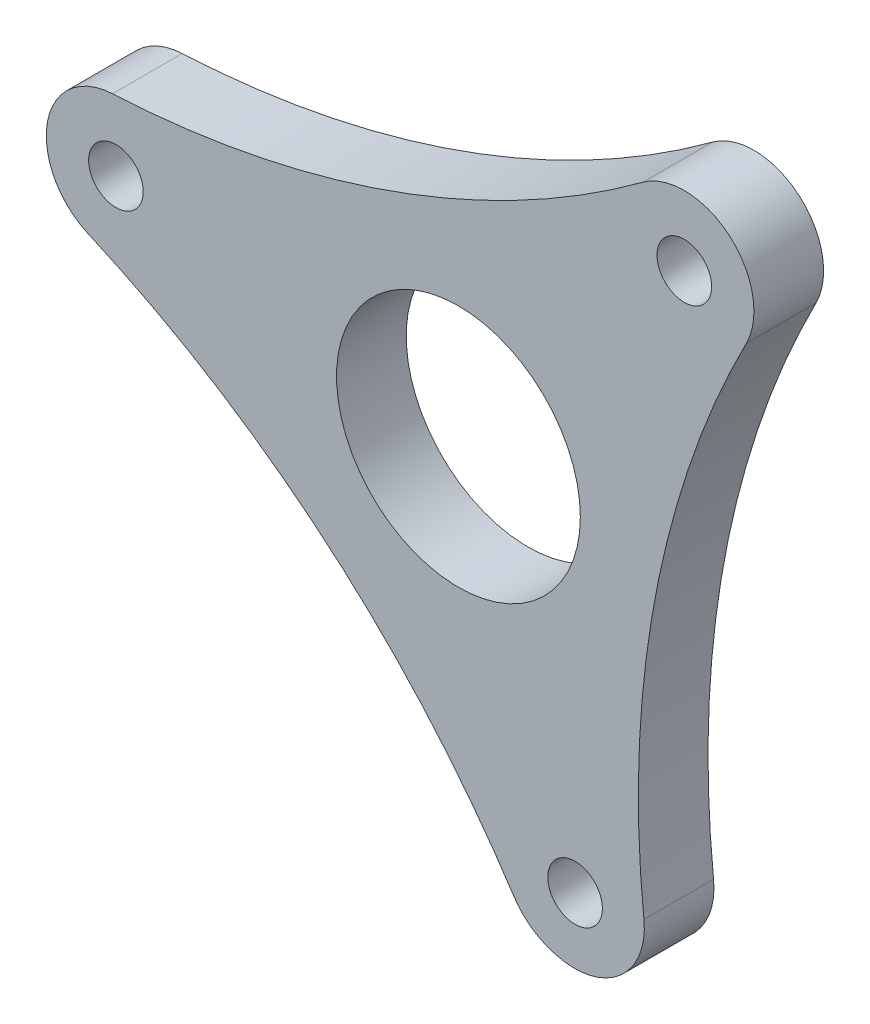
ISO-10303-21;
HEADER;
FILE_DESCRIPTION(('STEP AP214'),'2;1');
FILE_NAME('part.step','',(''),(''),'','','');
FILE_SCHEMA(('AUTOMOTIVE_DESIGN { 1 0 10303 214 1 1 1 1 }'));
ENDSEC;
DATA;
#1=APPLICATION_CONTEXT('core data for automotive mechanical design processes');
#2=APPLICATION_PROTOCOL_DEFINITION('international standard','automotive_design',2000,#1);
#3=PRODUCT_CONTEXT('',#1,'mechanical');
#4=PRODUCT('Part','Part','',(#3));
#5=PRODUCT_RELATED_PRODUCT_CATEGORY('part','',(#4));
#6=PRODUCT_DEFINITION_FORMATION('','',#4);
#7=PRODUCT_DEFINITION_CONTEXT('part definition',#1,'design');
#8=PRODUCT_DEFINITION('design','',#6,#7);
#9=PRODUCT_DEFINITION_SHAPE('','',#8);
#10=(LENGTH_UNIT() NAMED_UNIT(*) SI_UNIT(.MILLI.,.METRE.));
#11=(NAMED_UNIT(*) PLANE_ANGLE_UNIT() SI_UNIT($,.RADIAN.));
#12=(NAMED_UNIT(*) SI_UNIT($,.STERADIAN.) SOLID_ANGLE_UNIT());
#13=UNCERTAINTY_MEASURE_WITH_UNIT(LENGTH_MEASURE(1.E-05),#10,'distance_accuracy_value','');
#14=(GEOMETRIC_REPRESENTATION_CONTEXT(3) GLOBAL_UNCERTAINTY_ASSIGNED_CONTEXT((#13)) GLOBAL_UNIT_ASSIGNED_CONTEXT((#10,
#11,#12)) REPRESENTATION_CONTEXT('',''));
#15=CARTESIAN_POINT('',(0.,0.,0.));
#16=DIRECTION('',(0.,0.,1.));
#17=DIRECTION('',(1.,0.,0.));
#18=AXIS2_PLACEMENT_3D('',#15,#16,#17);
#19=CARTESIAN_POINT('',(86.3153760272279,-150.073761741357,6.35));
#20=DIRECTION('',(0.,0.,-1.));
#21=DIRECTION('',(-1.,0.,0.));
#22=AXIS2_PLACEMENT_3D('',#19,#20,#21);
#23=CYLINDRICAL_SURFACE('',#22,88.9);
#24=CARTESIAN_POINT('',(86.3153760272279,-150.073761741357,0.));
#25=DIRECTION('',(0.,0.,1.));
#26=DIRECTION('',(1.,0.,0.));
#27=AXIS2_PLACEMENT_3D('',#24,#25,#26);
#28=CIRCLE('',#27,88.9);
#29=CARTESIAN_POINT('',(121.980156320877,-68.6413760056704,0.));
#30=VERTEX_POINT('',#29);
#31=CARTESIAN_POINT('',(160.795035081524,-101.535216365998,0.));
#32=VERTEX_POINT('',#31);
#33=EDGE_CURVE('E144',#30,#32,#28,.F.);
#34=ORIENTED_EDGE('',*,*,#33,.T.);
#35=DIRECTION('',(0.,0.,-1.));
#36=VECTOR('',#35,1.);
#37=CARTESIAN_POINT('',(160.795035081527,-101.535216366003,6.35));
#38=LINE('',#37,#36);
#39=CARTESIAN_POINT('',(160.795035081524,-101.535216365998,6.35));
#40=VERTEX_POINT('',#39);
#41=EDGE_CURVE('E58',#32,#40,#38,.F.);
#42=ORIENTED_EDGE('',*,*,#41,.T.);
#43=CARTESIAN_POINT('',(86.3153760272279,-150.073761741357,6.35));
#44=DIRECTION('',(0.,0.,1.));
#45=DIRECTION('',(1.,0.,0.));
#46=AXIS2_PLACEMENT_3D('',#43,#44,#45);
#47=CIRCLE('',#46,88.9);
#48=CARTESIAN_POINT('',(121.980156320877,-68.6413760056704,6.35));
#49=VERTEX_POINT('',#48);
#50=EDGE_CURVE('E180',#49,#40,#47,.F.);
#51=ORIENTED_EDGE('',*,*,#50,.F.);
#52=DIRECTION('',(0.,0.,-1.));
#53=VECTOR('',#52,1.);
#54=CARTESIAN_POINT('',(121.980156320877,-68.6413760056704,6.35));
#55=LINE('',#54,#53);
#56=EDGE_CURVE('E137',#49,#30,#55,.T.);
#57=ORIENTED_EDGE('',*,*,#56,.T.);
#58=EDGE_LOOP('',(#34,#42,#51,#57));
#59=FACE_BOUND('',#58,.T.);
#60=ADVANCED_FACE('F35',(#59),#23,.F.);
#61=CARTESIAN_POINT('',(-15.0821674434747,-54.6417006359264,6.35));
#62=DIRECTION('',(0.266069897531643,0.963953738323319,0.));
#63=DIRECTION('',(-0.963953738323319,0.266069897531643,0.));
#64=AXIS2_PLACEMENT_3D('',#61,#62,#63);
#65=PLANE('',#64);
#66=DIRECTION('',(0.963953738323319,-0.266069897531643,0.));
#67=VECTOR('',#66,1.);
#68=CARTESIAN_POINT('',(-15.0821674434747,-54.6417006359264,6.35));
#69=LINE('',#68,#67);
#70=CARTESIAN_POINT('',(164.425466878937,-104.189283648973,6.35));
#71=VERTEX_POINT('',#70);
#72=CARTESIAN_POINT('',(164.659124528014,-104.253777684606,6.35));
#73=VERTEX_POINT('',#72);
#74=EDGE_CURVE('E109',#71,#73,#69,.T.);
#75=ORIENTED_EDGE('',*,*,#74,.F.);
#76=DIRECTION('',(0.,0.,-1.));
#77=VECTOR('',#76,1.);
#78=CARTESIAN_POINT('',(164.425466878937,-104.189283648973,6.35));
#79=LINE('',#78,#77);
#80=CARTESIAN_POINT('',(164.425466878937,-104.189283648973,0.));
#81=VERTEX_POINT('',#80);
#82=EDGE_CURVE('E170',#71,#81,#79,.T.);
#83=ORIENTED_EDGE('',*,*,#82,.T.);
#84=DIRECTION('',(0.963953738323319,-0.266069897531643,0.));
#85=VECTOR('',#84,1.);
#86=CARTESIAN_POINT('',(-15.0821674434747,-54.6417006359264,0.));
#87=LINE('',#86,#85);
#88=CARTESIAN_POINT('',(164.659124528014,-104.253777684606,0.));
#89=VERTEX_POINT('',#88);
#90=EDGE_CURVE('E146',#81,#89,#87,.T.);
#91=ORIENTED_EDGE('',*,*,#90,.T.);
#92=DIRECTION('',(0.,0.,-1.));
#93=VECTOR('',#92,1.);
#94=CARTESIAN_POINT('',(164.659124528014,-104.253777684606,6.35));
#95=LINE('',#94,#93);
#96=EDGE_CURVE('E118',#89,#73,#95,.F.);
#97=ORIENTED_EDGE('',*,*,#96,.T.);
#98=EDGE_LOOP('',(#75,#83,#91,#97));
#99=FACE_BOUND('',#98,.T.);
#100=ADVANCED_FACE('F184',(#99),#65,.F.);
#101=CARTESIAN_POINT('',(261.053590321017,-87.9571980104894,6.35));
#102=DIRECTION('',(0.,0.,-1.));
#103=DIRECTION('',(-1.,0.,0.));
#104=AXIS2_PLACEMENT_3D('',#101,#102,#103);
#105=CYLINDRICAL_SURFACE('',#104,88.9);
#106=CARTESIAN_POINT('',(261.053590321017,-87.9571980104894,6.35));
#107=DIRECTION('',(0.,0.,1.));
#108=DIRECTION('',(1.,0.,0.));
#109=AXIS2_PLACEMENT_3D('',#106,#107,#108);
#110=CIRCLE('',#109,88.9);
#111=CARTESIAN_POINT('',(172.662329840252,-97.4543065505352,6.35));
#112=VERTEX_POINT('',#111);
#113=CARTESIAN_POINT('',(181.990994200693,-47.3085092897694,6.35));
#114=VERTEX_POINT('',#113);
#115=EDGE_CURVE('E100',#112,#114,#110,.F.);
#116=ORIENTED_EDGE('',*,*,#115,.F.);
#117=DIRECTION('',(0.,0.,-1.));
#118=VECTOR('',#117,1.);
#119=CARTESIAN_POINT('',(172.662329840252,-97.4543065505353,6.35));
#120=LINE('',#119,#118);
#121=CARTESIAN_POINT('',(172.662329840252,-97.4543065505352,0.));
#122=VERTEX_POINT('',#121);
#123=EDGE_CURVE('E11',#112,#122,#120,.T.);
#124=ORIENTED_EDGE('',*,*,#123,.T.);
#125=CARTESIAN_POINT('',(261.053590321017,-87.9571980104894,0.));
#126=DIRECTION('',(0.,0.,1.));
#127=DIRECTION('',(1.,0.,0.));
#128=AXIS2_PLACEMENT_3D('',#125,#126,#127);
#129=CIRCLE('',#128,88.9);
#130=CARTESIAN_POINT('',(181.990994200693,-47.3085092897694,0.));
#131=VERTEX_POINT('',#130);
#132=EDGE_CURVE('E115',#122,#131,#129,.F.);
#133=ORIENTED_EDGE('',*,*,#132,.T.);
#134=DIRECTION('',(0.,0.,-1.));
#135=VECTOR('',#134,1.);
#136=CARTESIAN_POINT('',(181.990994200693,-47.3085092897694,6.35));
#137=LINE('',#136,#135);
#138=EDGE_CURVE('E112',#114,#131,#137,.T.);
#139=ORIENTED_EDGE('',*,*,#138,.F.);
#140=EDGE_LOOP('',(#116,#124,#133,#139));
#141=FACE_BOUND('',#140,.T.);
#142=ADVANCED_FACE('F113',(#141),#105,.F.);
#143=CARTESIAN_POINT('',(176.343665906384,-44.4050315240038,6.35));
#144=DIRECTION('',(0.,0.,-1.));
#145=DIRECTION('',(-1.,0.,0.));
#146=AXIS2_PLACEMENT_3D('',#143,#144,#145);
#147=CYLINDRICAL_SURFACE('',#146,6.3499999999997);
#148=CARTESIAN_POINT('',(176.343665906384,-44.4050315240038,0.));
#149=DIRECTION('',(0.,0.,1.));
#150=DIRECTION('',(1.,0.,0.));
#151=AXIS2_PLACEMENT_3D('',#148,#149,#150);
#152=CIRCLE('',#151,6.3499999999997);
#153=CARTESIAN_POINT('',(172.580085578452,-39.2905459081088,0.));
#154=VERTEX_POINT('',#153);
#155=EDGE_CURVE('E150',#131,#154,#152,.T.);
#156=ORIENTED_EDGE('',*,*,#155,.T.);
#157=DIRECTION('',(0.,0.,-1.));
#158=VECTOR('',#157,1.);
#159=CARTESIAN_POINT('',(172.580085578452,-39.2905459081088,6.35));
#160=LINE('',#159,#158);
#161=CARTESIAN_POINT('',(172.580085578452,-39.2905459081088,6.35));
#162=VERTEX_POINT('',#161);
#163=EDGE_CURVE('E119',#162,#154,#160,.T.);
#164=ORIENTED_EDGE('',*,*,#163,.F.);
#165=CARTESIAN_POINT('',(176.343665906384,-44.4050315240038,6.35));
#166=DIRECTION('',(0.,0.,1.));
#167=DIRECTION('',(1.,0.,0.));
#168=AXIS2_PLACEMENT_3D('',#165,#166,#167);
#169=CIRCLE('',#168,6.3499999999997);
#170=EDGE_CURVE('E105',#114,#162,#169,.T.);
#171=ORIENTED_EDGE('',*,*,#170,.F.);
#172=ORIENTED_EDGE('',*,*,#138,.T.);
#173=EDGE_LOOP('',(#156,#164,#171,#172));
#174=FACE_BOUND('',#173,.T.);
#175=ADVANCED_FACE('F121',(#174),#147,.T.);
#176=CARTESIAN_POINT('',(119.889960987396,32.3122527144273,6.35));
#177=DIRECTION('',(0.,0.,-1.));
#178=DIRECTION('',(-1.,0.,0.));
#179=AXIS2_PLACEMENT_3D('',#176,#177,#178);
#180=CYLINDRICAL_SURFACE('',#179,88.9);
#181=CARTESIAN_POINT('',(119.889960987396,32.3122527144273,0.));
#182=DIRECTION('',(0.,0.,1.));
#183=DIRECTION('',(1.,0.,0.));
#184=AXIS2_PLACEMENT_3D('',#181,#182,#183);
#185=CIRCLE('',#184,88.9);
#186=CARTESIAN_POINT('',(124.218461984888,-56.4823083752823,0.));
#187=VERTEX_POINT('',#186);
#188=EDGE_CURVE('E152',#154,#187,#185,.F.);
#189=ORIENTED_EDGE('',*,*,#188,.T.);
#190=DIRECTION('',(0.,0.,-1.));
#191=VECTOR('',#190,1.);
#192=CARTESIAN_POINT('',(124.218461984888,-56.4823083752823,6.35));
#193=LINE('',#192,#191);
#194=CARTESIAN_POINT('',(124.218461984888,-56.4823083752823,6.35));
#195=VERTEX_POINT('',#194);
#196=EDGE_CURVE('E165',#195,#187,#193,.T.);
#197=ORIENTED_EDGE('',*,*,#196,.F.);
#198=CARTESIAN_POINT('',(119.889960987396,32.3122527144273,6.35));
#199=DIRECTION('',(0.,0.,1.));
#200=DIRECTION('',(1.,0.,0.));
#201=AXIS2_PLACEMENT_3D('',#198,#199,#200);
#202=CIRCLE('',#201,88.9);
#203=EDGE_CURVE('E124',#162,#195,#202,.F.);
#204=ORIENTED_EDGE('',*,*,#203,.F.);
#205=ORIENTED_EDGE('',*,*,#163,.T.);
#206=EDGE_LOOP('',(#189,#197,#204,#205));
#207=FACE_BOUND('',#206,.T.);
#208=ADVANCED_FACE('F200',(#207),#180,.F.);
#209=CARTESIAN_POINT('',(124.527640627566,-62.8247770245487,6.35));
#210=DIRECTION('',(0.,0.,-1.));
#211=DIRECTION('',(-1.,0.,0.));
#212=AXIS2_PLACEMENT_3D('',#209,#210,#211);
#213=CYLINDRICAL_SURFACE('',#212,2.48920000000003);
#214=CARTESIAN_POINT('',(124.527640627566,-62.8247770245487,6.35));
#215=DIRECTION('',(0.,0.,1.));
#216=DIRECTION('',(1.,0.,0.));
#217=AXIS2_PLACEMENT_3D('',#214,#215,#216);
#218=CIRCLE('',#217,2.48920000000003);
#219=CARTESIAN_POINT('',(127.016840627566,-62.8247770245487,6.35));
#220=VERTEX_POINT('',#219);
#221=EDGE_CURVE('E131',#220,#220,#218,.T.);
#222=ORIENTED_EDGE('',*,*,#221,.T.);
#223=EDGE_LOOP('',(#222));
#224=FACE_BOUND('',#223,.T.);
#225=CARTESIAN_POINT('',(124.527640627566,-62.8247770245487,0.));
#226=DIRECTION('',(0.,0.,1.));
#227=DIRECTION('',(1.,0.,0.));
#228=AXIS2_PLACEMENT_3D('',#225,#226,#227);
#229=CIRCLE('',#228,2.48920000000003);
#230=CARTESIAN_POINT('',(127.016840627566,-62.8247770245487,0.));
#231=VERTEX_POINT('',#230);
#232=EDGE_CURVE('E156',#231,#231,#229,.T.);
#233=ORIENTED_EDGE('',*,*,#232,.F.);
#234=EDGE_LOOP('',(#233));
#235=FACE_BOUND('',#234,.T.);
#236=ADVANCED_FACE('F202',(#224,#235),#213,.F.);
#237=CARTESIAN_POINT('',(124.527640627566,-62.8247770245487,6.35));
#238=DIRECTION('',(0.,0.,-1.));
#239=DIRECTION('',(-1.,0.,0.));
#240=AXIS2_PLACEMENT_3D('',#237,#238,#239);
#241=CYLINDRICAL_SURFACE('',#240,6.3500000000013);
#242=CARTESIAN_POINT('',(124.527640627566,-62.8247770245487,0.));
#243=DIRECTION('',(0.,0.,1.));
#244=DIRECTION('',(1.,0.,0.));
#245=AXIS2_PLACEMENT_3D('',#242,#243,#244);
#246=CIRCLE('',#245,6.3500000000013);
#247=EDGE_CURVE('E154',#187,#30,#246,.T.);
#248=ORIENTED_EDGE('',*,*,#247,.T.);
#249=ORIENTED_EDGE('',*,*,#56,.F.);
#250=CARTESIAN_POINT('',(124.527640627566,-62.8247770245487,6.35));
#251=DIRECTION('',(0.,0.,1.));
#252=DIRECTION('',(1.,0.,0.));
#253=AXIS2_PLACEMENT_3D('',#250,#251,#252);
#254=CIRCLE('',#253,6.3500000000013);
#255=EDGE_CURVE('E126',#195,#49,#254,.T.);
#256=ORIENTED_EDGE('',*,*,#255,.F.);
#257=ORIENTED_EDGE('',*,*,#196,.T.);
#258=EDGE_LOOP('',(#248,#249,#256,#257));
#259=FACE_BOUND('',#258,.T.);
#260=ADVANCED_FACE('F196',(#259),#241,.T.);
#261=CARTESIAN_POINT('',(155.752975778547,-68.572902345806,6.35));
#262=DIRECTION('',(0.,0.,-1.));
#263=DIRECTION('',(-1.,0.,0.));
#264=AXIS2_PLACEMENT_3D('',#261,#262,#263);
#265=CYLINDRICAL_SURFACE('',#264,11.1125);
#266=CARTESIAN_POINT('',(155.752975778547,-68.572902345806,6.35));
#267=DIRECTION('',(0.,0.,1.));
#268=DIRECTION('',(1.,0.,0.));
#269=AXIS2_PLACEMENT_3D('',#266,#267,#268);
#270=CIRCLE('',#269,11.1125);
#271=CARTESIAN_POINT('',(166.865475778547,-68.572902345806,6.35));
#272=VERTEX_POINT('',#271);
#273=EDGE_CURVE('E349',#272,#272,#270,.T.);
#274=ORIENTED_EDGE('',*,*,#273,.T.);
#275=EDGE_LOOP('',(#274));
#276=FACE_BOUND('',#275,.T.);
#277=CARTESIAN_POINT('',(155.752975778547,-68.572902345806,0.));
#278=DIRECTION('',(0.,0.,1.));
#279=DIRECTION('',(1.,0.,0.));
#280=AXIS2_PLACEMENT_3D('',#277,#278,#279);
#281=CIRCLE('',#280,11.1125);
#282=CARTESIAN_POINT('',(166.865475778547,-68.572902345806,0.));
#283=VERTEX_POINT('',#282);
#284=EDGE_CURVE('E141',#283,#283,#281,.T.);
#285=ORIENTED_EDGE('',*,*,#284,.F.);
#286=EDGE_LOOP('',(#285));
#287=FACE_BOUND('',#286,.T.);
#288=ADVANCED_FACE('F220',(#276,#287),#265,.F.);
#289=CARTESIAN_POINT('',(176.343665906384,-44.4050315240038,6.35));
#290=DIRECTION('',(0.,0.,-1.));
#291=DIRECTION('',(-1.,0.,0.));
#292=AXIS2_PLACEMENT_3D('',#289,#290,#291);
#293=CYLINDRICAL_SURFACE('',#292,2.4892);
#294=CARTESIAN_POINT('',(176.343665906384,-44.4050315240038,6.35));
#295=DIRECTION('',(0.,0.,1.));
#296=DIRECTION('',(1.,0.,0.));
#297=AXIS2_PLACEMENT_3D('',#294,#295,#296);
#298=CIRCLE('',#297,2.4892);
#299=CARTESIAN_POINT('',(178.832865906384,-44.4050315240038,6.35));
#300=VERTEX_POINT('',#299);
#301=EDGE_CURVE('E162',#300,#300,#298,.T.);
#302=ORIENTED_EDGE('',*,*,#301,.T.);
#303=EDGE_LOOP('',(#302));
#304=FACE_BOUND('',#303,.T.);
#305=CARTESIAN_POINT('',(176.343665906384,-44.4050315240038,0.));
#306=DIRECTION('',(0.,0.,1.));
#307=DIRECTION('',(1.,0.,0.));
#308=AXIS2_PLACEMENT_3D('',#305,#306,#307);
#309=CIRCLE('',#308,2.4892);
#310=CARTESIAN_POINT('',(178.832865906384,-44.4050315240038,0.));
#311=VERTEX_POINT('',#310);
#312=EDGE_CURVE('E138',#311,#311,#309,.T.);
#313=ORIENTED_EDGE('',*,*,#312,.F.);
#314=EDGE_LOOP('',(#313));
#315=FACE_BOUND('',#314,.T.);
#316=ADVANCED_FACE('F223',(#304,#315),#293,.F.);
#317=CARTESIAN_POINT('',(166.387620801694,-98.4888984888661,6.35));
#318=DIRECTION('',(0.,0.,-1.));
#319=DIRECTION('',(-1.,0.,0.));
#320=AXIS2_PLACEMENT_3D('',#317,#318,#319);
#321=CYLINDRICAL_SURFACE('',#320,2.48920000000091);
#322=CARTESIAN_POINT('',(166.387620801694,-98.4888984888661,6.35));
#323=DIRECTION('',(0.,0.,1.));
#324=DIRECTION('',(1.,0.,0.));
#325=AXIS2_PLACEMENT_3D('',#322,#323,#324);
#326=CIRCLE('',#325,2.48920000000091);
#327=CARTESIAN_POINT('',(168.876820801695,-98.4888984888661,6.35));
#328=VERTEX_POINT('',#327);
#329=EDGE_CURVE('E134',#328,#328,#326,.T.);
#330=ORIENTED_EDGE('',*,*,#329,.T.);
#331=EDGE_LOOP('',(#330));
#332=FACE_BOUND('',#331,.T.);
#333=CARTESIAN_POINT('',(166.387620801694,-98.4888984888661,0.));
#334=DIRECTION('',(0.,0.,1.));
#335=DIRECTION('',(1.,0.,0.));
#336=AXIS2_PLACEMENT_3D('',#333,#334,#335);
#337=CIRCLE('',#336,2.48920000000091);
#338=CARTESIAN_POINT('',(168.876820801695,-98.4888984888661,0.));
#339=VERTEX_POINT('',#338);
#340=EDGE_CURVE('E159',#339,#339,#337,.T.);
#341=ORIENTED_EDGE('',*,*,#340,.F.);
#342=EDGE_LOOP('',(#341));
#343=FACE_BOUND('',#342,.T.);
#344=ADVANCED_FACE('F226',(#332,#343),#321,.F.);
#345=CARTESIAN_POINT('',(0.,0.,6.35));
#346=DIRECTION('',(0.,0.,1.));
#347=DIRECTION('',(1.,0.,0.));
#348=AXIS2_PLACEMENT_3D('',#345,#346,#347);
#349=PLANE('',#348);
#350=ORIENTED_EDGE('',*,*,#301,.F.);
#351=EDGE_LOOP('',(#350));
#352=FACE_BOUND('',#351,.T.);
#353=ORIENTED_EDGE('',*,*,#273,.F.);
#354=EDGE_LOOP('',(#353));
#355=FACE_BOUND('',#354,.T.);
#356=ORIENTED_EDGE('',*,*,#50,.T.);
#357=CARTESIAN_POINT('',(166.115010728263,-98.0681774106204,6.35));
#358=DIRECTION('',(0.,0.,1.));
#359=DIRECTION('',(1.,0.,0.));
#360=AXIS2_PLACEMENT_3D('',#357,#358,#359);
#361=CIRCLE('',#360,6.35);
#362=EDGE_CURVE('E43',#40,#71,#361,.T.);
#363=ORIENTED_EDGE('',*,*,#362,.T.);
#364=ORIENTED_EDGE('',*,*,#74,.T.);
#365=CARTESIAN_POINT('',(166.34866837734,-98.1326714462528,6.35));
#366=DIRECTION('',(0.,0.,1.));
#367=DIRECTION('',(1.,0.,0.));
#368=AXIS2_PLACEMENT_3D('',#365,#366,#367);
#369=CIRCLE('',#368,6.35);
#370=EDGE_CURVE('E50',#73,#112,#369,.T.);
#371=ORIENTED_EDGE('',*,*,#370,.T.);
#372=ORIENTED_EDGE('',*,*,#115,.T.);
#373=ORIENTED_EDGE('',*,*,#170,.T.);
#374=ORIENTED_EDGE('',*,*,#203,.T.);
#375=ORIENTED_EDGE('',*,*,#255,.T.);
#376=EDGE_LOOP('',(#356,#363,#364,#371,#372,#373,#374,#375));
#377=FACE_BOUND('',#376,.T.);
#378=ORIENTED_EDGE('',*,*,#221,.F.);
#379=EDGE_LOOP('',(#378));
#380=FACE_BOUND('',#379,.T.);
#381=ORIENTED_EDGE('',*,*,#329,.F.);
#382=EDGE_LOOP('',(#381));
#383=FACE_BOUND('',#382,.T.);
#384=ADVANCED_FACE('F102',(#352,#355,#377,#380,#383),#349,.T.);
#385=CARTESIAN_POINT('',(0.,0.,0.));
#386=DIRECTION('',(0.,0.,1.));
#387=DIRECTION('',(1.,0.,0.));
#388=AXIS2_PLACEMENT_3D('',#385,#386,#387);
#389=PLANE('',#388);
#390=ORIENTED_EDGE('',*,*,#312,.T.);
#391=EDGE_LOOP('',(#390));
#392=FACE_BOUND('',#391,.T.);
#393=ORIENTED_EDGE('',*,*,#284,.T.);
#394=EDGE_LOOP('',(#393));
#395=FACE_BOUND('',#394,.T.);
#396=ORIENTED_EDGE('',*,*,#90,.F.);
#397=CARTESIAN_POINT('',(166.115010728263,-98.0681774106204,0.));
#398=DIRECTION('',(0.,0.,1.));
#399=DIRECTION('',(1.,0.,0.));
#400=AXIS2_PLACEMENT_3D('',#397,#398,#399);
#401=CIRCLE('',#400,6.35);
#402=EDGE_CURVE('E175',#81,#32,#401,.F.);
#403=ORIENTED_EDGE('',*,*,#402,.T.);
#404=ORIENTED_EDGE('',*,*,#33,.F.);
#405=ORIENTED_EDGE('',*,*,#247,.F.);
#406=ORIENTED_EDGE('',*,*,#188,.F.);
#407=ORIENTED_EDGE('',*,*,#155,.F.);
#408=ORIENTED_EDGE('',*,*,#132,.F.);
#409=CARTESIAN_POINT('',(166.34866837734,-98.1326714462528,0.));
#410=DIRECTION('',(0.,0.,1.));
#411=DIRECTION('',(1.,0.,0.));
#412=AXIS2_PLACEMENT_3D('',#409,#410,#411);
#413=CIRCLE('',#412,6.35);
#414=EDGE_CURVE('E173',#122,#89,#413,.F.);
#415=ORIENTED_EDGE('',*,*,#414,.T.);
#416=EDGE_LOOP('',(#396,#403,#404,#405,#406,#407,#408,#415));
#417=FACE_BOUND('',#416,.T.);
#418=ORIENTED_EDGE('',*,*,#232,.T.);
#419=EDGE_LOOP('',(#418));
#420=FACE_BOUND('',#419,.T.);
#421=ORIENTED_EDGE('',*,*,#340,.T.);
#422=EDGE_LOOP('',(#421));
#423=FACE_BOUND('',#422,.T.);
#424=ADVANCED_FACE('F190',(#392,#395,#417,#420,#423),#389,.F.);
#425=CARTESIAN_POINT('',(166.115010728263,-98.0681774106204,6.35));
#426=DIRECTION('',(0.,0.,-1.));
#427=DIRECTION('',(-1.,0.,0.));
#428=AXIS2_PLACEMENT_3D('',#425,#426,#427);
#429=CYLINDRICAL_SURFACE('',#428,6.35);
#430=ORIENTED_EDGE('',*,*,#362,.F.);
#431=ORIENTED_EDGE('',*,*,#41,.F.);
#432=ORIENTED_EDGE('',*,*,#402,.F.);
#433=ORIENTED_EDGE('',*,*,#82,.F.);
#434=EDGE_LOOP('',(#430,#431,#432,#433));
#435=FACE_BOUND('',#434,.T.);
#436=ADVANCED_FACE('F187',(#435),#429,.T.);
#437=CARTESIAN_POINT('',(166.34866837734,-98.1326714462528,6.35));
#438=DIRECTION('',(0.,0.,-1.));
#439=DIRECTION('',(-1.,0.,0.));
#440=AXIS2_PLACEMENT_3D('',#437,#438,#439);
#441=CYLINDRICAL_SURFACE('',#440,6.35);
#442=ORIENTED_EDGE('',*,*,#370,.F.);
#443=ORIENTED_EDGE('',*,*,#96,.F.);
#444=ORIENTED_EDGE('',*,*,#414,.F.);
#445=ORIENTED_EDGE('',*,*,#123,.F.);
#446=EDGE_LOOP('',(#442,#443,#444,#445));
#447=FACE_BOUND('',#446,.T.);
#448=ADVANCED_FACE('F37',(#447),#441,.T.);
#449=CLOSED_SHELL('',(#60,#100,#142,#175,#208,#236,#260,#288,#316,#344,#384,#424,#436,#448));
#450=MANIFOLD_SOLID_BREP('B2',#449);
#451=ADVANCED_BREP_SHAPE_REPRESENTATION('',(#18,#450),#14);
#452=SHAPE_DEFINITION_REPRESENTATION(#9,#451);
ENDSEC;
END-ISO-10303-21;
